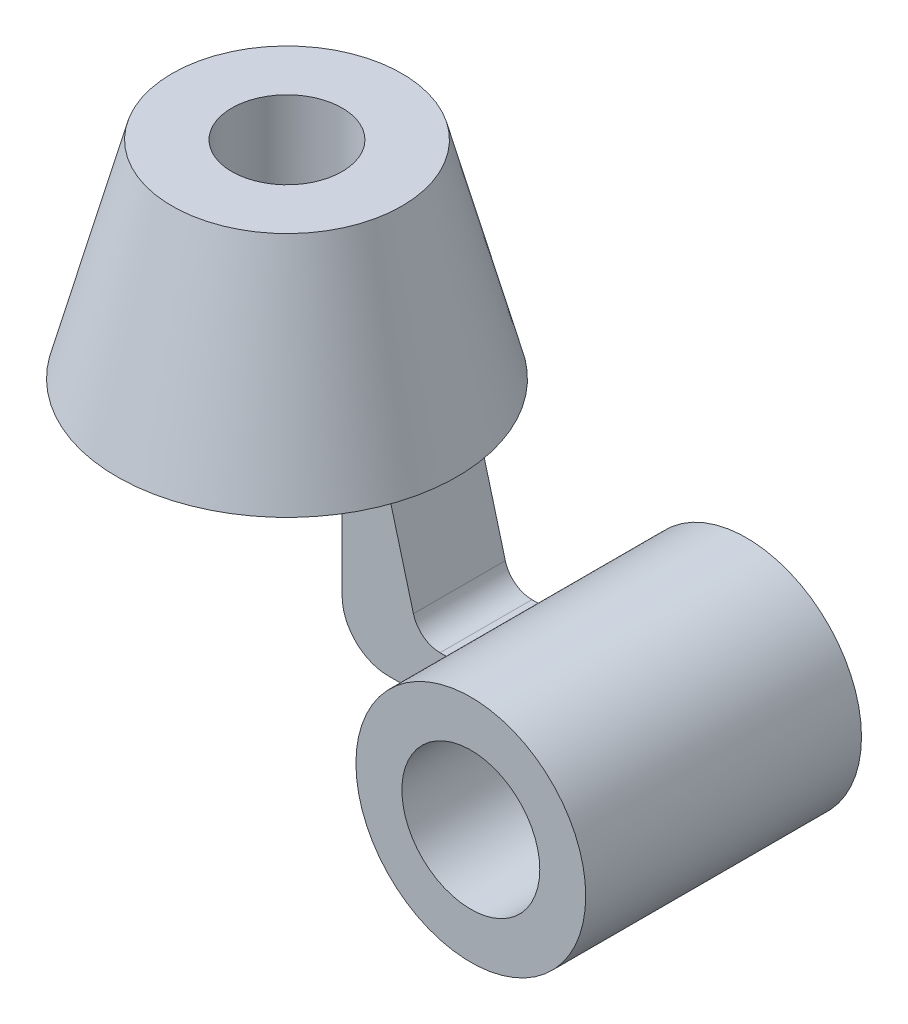
ISO-10303-21;
HEADER;
FILE_DESCRIPTION(('STEP AP214'),'2;1');
FILE_NAME('part.step','',(''),(''),'','','');
FILE_SCHEMA(('AUTOMOTIVE_DESIGN { 1 0 10303 214 1 1 1 1 }'));
ENDSEC;
DATA;
#1=APPLICATION_CONTEXT('core data for automotive mechanical design processes');
#2=APPLICATION_PROTOCOL_DEFINITION('international standard','automotive_design',2000,#1);
#3=PRODUCT_CONTEXT('',#1,'mechanical');
#4=PRODUCT('Part','Part','',(#3));
#5=PRODUCT_RELATED_PRODUCT_CATEGORY('part','',(#4));
#6=PRODUCT_DEFINITION_FORMATION('','',#4);
#7=PRODUCT_DEFINITION_CONTEXT('part definition',#1,'design');
#8=PRODUCT_DEFINITION('design','',#6,#7);
#9=PRODUCT_DEFINITION_SHAPE('','',#8);
#10=(LENGTH_UNIT() NAMED_UNIT(*) SI_UNIT(.MILLI.,.METRE.));
#11=(NAMED_UNIT(*) PLANE_ANGLE_UNIT() SI_UNIT($,.RADIAN.));
#12=(NAMED_UNIT(*) SI_UNIT($,.STERADIAN.) SOLID_ANGLE_UNIT());
#13=UNCERTAINTY_MEASURE_WITH_UNIT(LENGTH_MEASURE(1.E-05),#10,'distance_accuracy_value','');
#14=(GEOMETRIC_REPRESENTATION_CONTEXT(3) GLOBAL_UNCERTAINTY_ASSIGNED_CONTEXT((#13)) GLOBAL_UNIT_ASSIGNED_CONTEXT((#10,
#11,#12)) REPRESENTATION_CONTEXT('',''));
#15=CARTESIAN_POINT('',(0.,0.,0.));
#16=DIRECTION('',(0.,0.,1.));
#17=DIRECTION('',(1.,0.,0.));
#18=AXIS2_PLACEMENT_3D('',#15,#16,#17);
#19=CARTESIAN_POINT('',(0.,0.,0.));
#20=DIRECTION('',(0.,1.,0.));
#21=DIRECTION('',(-1.,0.,0.));
#22=AXIS2_PLACEMENT_3D('',#19,#20,#21);
#23=PLANE('',#22);
#24=CARTESIAN_POINT('',(0.,0.,0.));
#25=DIRECTION('',(0.,1.,0.));
#26=DIRECTION('',(-1.,0.,0.));
#27=AXIS2_PLACEMENT_3D('',#24,#25,#26);
#28=CIRCLE('',#27,12.);
#29=CARTESIAN_POINT('',(-12.,0.,0.));
#30=VERTEX_POINT('',#29);
#31=EDGE_CURVE('E228',#30,#30,#28,.T.);
#32=ORIENTED_EDGE('',*,*,#31,.T.);
#33=EDGE_LOOP('',(#32));
#34=FACE_BOUND('',#33,.T.);
#35=DIRECTION('',(-1.,0.,0.));
#36=VECTOR('',#35,1.);
#37=CARTESIAN_POINT('',(32.,0.,-10.));
#38=LINE('',#37,#36);
#39=CARTESIAN_POINT('',(32.,0.,-10.));
#40=VERTEX_POINT('',#39);
#41=CARTESIAN_POINT('',(22.,0.,-10.));
#42=VERTEX_POINT('',#41);
#43=EDGE_CURVE('E152',#40,#42,#38,.T.);
#44=ORIENTED_EDGE('',*,*,#43,.T.);
#45=DIRECTION('',(0.,0.,1.));
#46=VECTOR('',#45,1.);
#47=CARTESIAN_POINT('',(22.,0.,-10.));
#48=LINE('',#47,#46);
#49=CARTESIAN_POINT('',(22.,0.,10.));
#50=VERTEX_POINT('',#49);
#51=EDGE_CURVE('E170',#42,#50,#48,.T.);
#52=ORIENTED_EDGE('',*,*,#51,.T.);
#53=DIRECTION('',(-1.,0.,0.));
#54=VECTOR('',#53,1.);
#55=CARTESIAN_POINT('',(32.,0.,10.));
#56=LINE('',#55,#54);
#57=CARTESIAN_POINT('',(32.,0.,10.));
#58=VERTEX_POINT('',#57);
#59=EDGE_CURVE('E217',#58,#50,#56,.T.);
#60=ORIENTED_EDGE('',*,*,#59,.F.);
#61=DIRECTION('',(0.,0.,1.));
#62=VECTOR('',#61,1.);
#63=CARTESIAN_POINT('',(32.,0.,-10.));
#64=LINE('',#63,#62);
#65=EDGE_CURVE('E169',#40,#58,#64,.T.);
#66=ORIENTED_EDGE('',*,*,#65,.F.);
#67=EDGE_LOOP('',(#44,#52,#60,#66));
#68=FACE_BOUND('',#67,.T.);
#69=CARTESIAN_POINT('',(0.,0.,0.));
#70=DIRECTION('',(0.,1.,0.));
#71=DIRECTION('',(-1.,0.,0.));
#72=AXIS2_PLACEMENT_3D('',#69,#70,#71);
#73=CIRCLE('',#72,37.);
#74=CARTESIAN_POINT('',(-37.,0.,0.));
#75=VERTEX_POINT('',#74);
#76=EDGE_CURVE('E130',#75,#75,#73,.T.);
#77=ORIENTED_EDGE('',*,*,#76,.F.);
#78=EDGE_LOOP('',(#77));
#79=FACE_BOUND('',#78,.T.);
#80=ADVANCED_FACE('F39',(#34,#68,#79),#23,.F.);
#81=CARTESIAN_POINT('',(0.,0.,0.));
#82=DIRECTION('',(0.,-1.,0.));
#83=DIRECTION('',(1.,0.,0.));
#84=AXIS2_PLACEMENT_3D('',#81,#82,#83);
#85=CONICAL_SURFACE('',#84,37.,0.260602391747341);
#86=CARTESIAN_POINT('',(0.,45.,0.));
#87=DIRECTION('',(0.,1.,0.));
#88=DIRECTION('',(-1.,0.,0.));
#89=AXIS2_PLACEMENT_3D('',#86,#87,#88);
#90=CIRCLE('',#89,25.);
#91=CARTESIAN_POINT('',(-25.,45.,0.));
#92=VERTEX_POINT('',#91);
#93=EDGE_CURVE('E135',#92,#92,#90,.T.);
#94=ORIENTED_EDGE('',*,*,#93,.F.);
#95=EDGE_LOOP('',(#94));
#96=FACE_BOUND('',#95,.T.);
#97=ORIENTED_EDGE('',*,*,#76,.T.);
#98=EDGE_LOOP('',(#97));
#99=FACE_BOUND('',#98,.T.);
#100=ADVANCED_FACE('F180',(#96,#99),#85,.T.);
#101=CARTESIAN_POINT('',(25.,45.,0.));
#102=DIRECTION('',(0.,-1.,0.));
#103=DIRECTION('',(1.,0.,0.));
#104=AXIS2_PLACEMENT_3D('',#101,#102,#103);
#105=PLANE('',#104);
#106=CARTESIAN_POINT('',(0.,45.,0.));
#107=DIRECTION('',(0.,1.,0.));
#108=DIRECTION('',(0.,0.,1.));
#109=AXIS2_PLACEMENT_3D('',#106,#107,#108);
#110=CIRCLE('',#109,12.);
#111=CARTESIAN_POINT('',(0.,45.,12.));
#112=VERTEX_POINT('',#111);
#113=EDGE_CURVE('E231',#112,#112,#110,.T.);
#114=ORIENTED_EDGE('',*,*,#113,.F.);
#115=EDGE_LOOP('',(#114));
#116=FACE_BOUND('',#115,.T.);
#117=ORIENTED_EDGE('',*,*,#93,.T.);
#118=EDGE_LOOP('',(#117));
#119=FACE_BOUND('',#118,.T.);
#120=ADVANCED_FACE('F174',(#116,#119),#105,.F.);
#121=CARTESIAN_POINT('',(38.6987298107779,-25.,-10.));
#122=DIRECTION('',(0.96592582628907,0.258819045102515,0.));
#123=DIRECTION('',(-0.258819045102515,0.96592582628907,0.));
#124=AXIS2_PLACEMENT_3D('',#121,#122,#123);
#125=PLANE('',#124);
#126=DIRECTION('',(-0.258819045102515,0.96592582628907,0.));
#127=VECTOR('',#126,1.);
#128=CARTESIAN_POINT('',(38.6987298107779,-25.,10.));
#129=LINE('',#128,#127);
#130=CARTESIAN_POINT('',(37.5071367809173,-20.5529142706151,10.));
#131=VERTEX_POINT('',#130);
#132=EDGE_CURVE('E155',#131,#58,#129,.T.);
#133=ORIENTED_EDGE('',*,*,#132,.F.);
#134=DIRECTION('',(0.,0.,1.));
#135=VECTOR('',#134,1.);
#136=CARTESIAN_POINT('',(37.5071367809173,-20.5529142706151,-10.));
#137=LINE('',#136,#135);
#138=CARTESIAN_POINT('',(37.5071367809173,-20.5529142706151,-10.));
#139=VERTEX_POINT('',#138);
#140=EDGE_CURVE('E53',#131,#139,#137,.F.);
#141=ORIENTED_EDGE('',*,*,#140,.T.);
#142=DIRECTION('',(-0.258819045102515,0.96592582628907,0.));
#143=VECTOR('',#142,1.);
#144=CARTESIAN_POINT('',(38.6987298107779,-25.,-10.));
#145=LINE('',#144,#143);
#146=EDGE_CURVE('E164',#139,#40,#145,.T.);
#147=ORIENTED_EDGE('',*,*,#146,.T.);
#148=ORIENTED_EDGE('',*,*,#65,.T.);
#149=EDGE_LOOP('',(#133,#141,#147,#148));
#150=FACE_BOUND('',#149,.T.);
#151=ADVANCED_FACE('F220',(#150),#125,.T.);
#152=CARTESIAN_POINT('',(55.5785022667471,-25.,-10.));
#153=DIRECTION('',(0.,1.,0.));
#154=DIRECTION('',(-1.,0.,0.));
#155=AXIS2_PLACEMENT_3D('',#152,#153,#154);
#156=PLANE('',#155);
#157=DIRECTION('',(-1.,0.,0.));
#158=VECTOR('',#157,1.);
#159=CARTESIAN_POINT('',(55.5785022667471,-25.,-10.));
#160=LINE('',#159,#158);
#161=CARTESIAN_POINT('',(47.0871215252208,-25.,-10.));
#162=VERTEX_POINT('',#161);
#163=CARTESIAN_POINT('',(43.3026917386517,-25.,-10.));
#164=VERTEX_POINT('',#163);
#165=EDGE_CURVE('E149',#162,#164,#160,.T.);
#166=ORIENTED_EDGE('',*,*,#165,.T.);
#167=DIRECTION('',(0.,0.,1.));
#168=VECTOR('',#167,1.);
#169=CARTESIAN_POINT('',(43.3026917386517,-25.,10.));
#170=LINE('',#169,#168);
#171=CARTESIAN_POINT('',(43.3026917386517,-25.,10.));
#172=VERTEX_POINT('',#171);
#173=EDGE_CURVE('E143',#164,#172,#170,.T.);
#174=ORIENTED_EDGE('',*,*,#173,.T.);
#175=DIRECTION('',(-1.,0.,0.));
#176=VECTOR('',#175,1.);
#177=CARTESIAN_POINT('',(55.5785022667471,-25.,10.));
#178=LINE('',#177,#176);
#179=CARTESIAN_POINT('',(47.0871215252208,-25.,10.));
#180=VERTEX_POINT('',#179);
#181=EDGE_CURVE('E109',#180,#172,#178,.T.);
#182=ORIENTED_EDGE('',*,*,#181,.F.);
#183=DIRECTION('',(0.,0.,1.));
#184=VECTOR('',#183,1.);
#185=CARTESIAN_POINT('',(47.0871215252208,-25.,-30.));
#186=LINE('',#185,#184);
#187=EDGE_CURVE('E121',#162,#180,#186,.T.);
#188=ORIENTED_EDGE('',*,*,#187,.F.);
#189=EDGE_LOOP('',(#166,#174,#182,#188));
#190=FACE_BOUND('',#189,.T.);
#191=ADVANCED_FACE('F150',(#190),#156,.T.);
#192=CARTESIAN_POINT('',(22.,-35.,-10.));
#193=DIRECTION('',(0.,-1.,0.));
#194=DIRECTION('',(0.,0.,-1.));
#195=AXIS2_PLACEMENT_3D('',#192,#193,#194);
#196=PLANE('',#195);
#197=DIRECTION('',(1.,0.,0.));
#198=VECTOR('',#197,1.);
#199=CARTESIAN_POINT('',(22.,-35.,10.));
#200=LINE('',#199,#198);
#201=CARTESIAN_POINT('',(32.,-35.,10.));
#202=VERTEX_POINT('',#201);
#203=CARTESIAN_POINT('',(45.,-35.,10.));
#204=VERTEX_POINT('',#203);
#205=EDGE_CURVE('E99',#202,#204,#200,.T.);
#206=ORIENTED_EDGE('',*,*,#205,.F.);
#207=DIRECTION('',(0.,0.,1.));
#208=VECTOR('',#207,1.);
#209=CARTESIAN_POINT('',(32.,-35.,-10.));
#210=LINE('',#209,#208);
#211=CARTESIAN_POINT('',(32.,-35.,-10.));
#212=VERTEX_POINT('',#211);
#213=EDGE_CURVE('E140',#202,#212,#210,.F.);
#214=ORIENTED_EDGE('',*,*,#213,.T.);
#215=DIRECTION('',(1.,0.,0.));
#216=VECTOR('',#215,1.);
#217=CARTESIAN_POINT('',(22.,-35.,-10.));
#218=LINE('',#217,#216);
#219=CARTESIAN_POINT('',(45.,-35.,-10.));
#220=VERTEX_POINT('',#219);
#221=EDGE_CURVE('E120',#212,#220,#218,.T.);
#222=ORIENTED_EDGE('',*,*,#221,.T.);
#223=DIRECTION('',(0.,0.,1.));
#224=VECTOR('',#223,1.);
#225=CARTESIAN_POINT('',(45.,-35.,-30.));
#226=LINE('',#225,#224);
#227=EDGE_CURVE('E111',#204,#220,#226,.F.);
#228=ORIENTED_EDGE('',*,*,#227,.F.);
#229=EDGE_LOOP('',(#206,#214,#222,#228));
#230=FACE_BOUND('',#229,.T.);
#231=ADVANCED_FACE('F113',(#230),#196,.T.);
#232=CARTESIAN_POINT('',(22.,0.,-10.));
#233=DIRECTION('',(-1.,0.,0.));
#234=DIRECTION('',(0.,-1.,0.));
#235=AXIS2_PLACEMENT_3D('',#232,#233,#234);
#236=PLANE('',#235);
#237=DIRECTION('',(0.,-1.,0.));
#238=VECTOR('',#237,1.);
#239=CARTESIAN_POINT('',(22.,0.,-10.));
#240=LINE('',#239,#238);
#241=CARTESIAN_POINT('',(22.,-25.,-10.));
#242=VERTEX_POINT('',#241);
#243=EDGE_CURVE('E159',#42,#242,#240,.T.);
#244=ORIENTED_EDGE('',*,*,#243,.T.);
#245=DIRECTION('',(0.,0.,1.));
#246=VECTOR('',#245,1.);
#247=CARTESIAN_POINT('',(22.,-25.,-10.));
#248=LINE('',#247,#246);
#249=CARTESIAN_POINT('',(22.,-25.,10.));
#250=VERTEX_POINT('',#249);
#251=EDGE_CURVE('E127',#242,#250,#248,.T.);
#252=ORIENTED_EDGE('',*,*,#251,.T.);
#253=DIRECTION('',(0.,-1.,0.));
#254=VECTOR('',#253,1.);
#255=CARTESIAN_POINT('',(22.,0.,10.));
#256=LINE('',#255,#254);
#257=EDGE_CURVE('E112',#50,#250,#256,.T.);
#258=ORIENTED_EDGE('',*,*,#257,.F.);
#259=ORIENTED_EDGE('',*,*,#51,.F.);
#260=EDGE_LOOP('',(#244,#252,#258,#259));
#261=FACE_BOUND('',#260,.T.);
#262=ADVANCED_FACE('F213',(#261),#236,.T.);
#263=CARTESIAN_POINT('',(0.,0.,-10.));
#264=DIRECTION('',(0.,0.,1.));
#265=DIRECTION('',(1.,0.,0.));
#266=AXIS2_PLACEMENT_3D('',#263,#264,#265);
#267=PLANE('',#266);
#268=ORIENTED_EDGE('',*,*,#221,.F.);
#269=CARTESIAN_POINT('',(32.,-25.,-10.));
#270=DIRECTION('',(0.,0.,1.));
#271=DIRECTION('',(1.,0.,0.));
#272=AXIS2_PLACEMENT_3D('',#269,#270,#271);
#273=CIRCLE('',#272,10.);
#274=EDGE_CURVE('E137',#212,#242,#273,.F.);
#275=ORIENTED_EDGE('',*,*,#274,.T.);
#276=ORIENTED_EDGE('',*,*,#243,.F.);
#277=ORIENTED_EDGE('',*,*,#43,.F.);
#278=ORIENTED_EDGE('',*,*,#146,.F.);
#279=CARTESIAN_POINT('',(43.3026917386517,-19.,-10.));
#280=DIRECTION('',(0.,0.,1.));
#281=DIRECTION('',(1.,0.,0.));
#282=AXIS2_PLACEMENT_3D('',#279,#280,#281);
#283=CIRCLE('',#282,6.);
#284=EDGE_CURVE('E11',#139,#164,#283,.T.);
#285=ORIENTED_EDGE('',*,*,#284,.T.);
#286=ORIENTED_EDGE('',*,*,#165,.F.);
#287=CARTESIAN_POINT('',(70.,-35.,-10.));
#288=DIRECTION('',(0.,0.,1.));
#289=DIRECTION('',(1.,0.,0.));
#290=AXIS2_PLACEMENT_3D('',#287,#288,#289);
#291=CIRCLE('',#290,25.);
#292=EDGE_CURVE('E218',#162,#220,#291,.T.);
#293=ORIENTED_EDGE('',*,*,#292,.T.);
#294=EDGE_LOOP('',(#268,#275,#276,#277,#278,#285,#286,#293));
#295=FACE_BOUND('',#294,.T.);
#296=ADVANCED_FACE('F207',(#295),#267,.F.);
#297=CARTESIAN_POINT('',(0.,0.,10.));
#298=DIRECTION('',(0.,0.,1.));
#299=DIRECTION('',(1.,0.,0.));
#300=AXIS2_PLACEMENT_3D('',#297,#298,#299);
#301=PLANE('',#300);
#302=ORIENTED_EDGE('',*,*,#257,.T.);
#303=CARTESIAN_POINT('',(32.,-25.,10.));
#304=DIRECTION('',(0.,0.,1.));
#305=DIRECTION('',(1.,0.,0.));
#306=AXIS2_PLACEMENT_3D('',#303,#304,#305);
#307=CIRCLE('',#306,10.);
#308=EDGE_CURVE('E110',#250,#202,#307,.T.);
#309=ORIENTED_EDGE('',*,*,#308,.T.);
#310=ORIENTED_EDGE('',*,*,#205,.T.);
#311=CARTESIAN_POINT('',(70.,-35.,10.));
#312=DIRECTION('',(0.,0.,1.));
#313=DIRECTION('',(1.,0.,0.));
#314=AXIS2_PLACEMENT_3D('',#311,#312,#313);
#315=CIRCLE('',#314,25.);
#316=EDGE_CURVE('E104',#180,#204,#315,.T.);
#317=ORIENTED_EDGE('',*,*,#316,.F.);
#318=ORIENTED_EDGE('',*,*,#181,.T.);
#319=CARTESIAN_POINT('',(43.3026917386517,-19.,10.));
#320=DIRECTION('',(0.,0.,1.));
#321=DIRECTION('',(1.,0.,0.));
#322=AXIS2_PLACEMENT_3D('',#319,#320,#321);
#323=CIRCLE('',#322,6.);
#324=EDGE_CURVE('E50',#172,#131,#323,.F.);
#325=ORIENTED_EDGE('',*,*,#324,.T.);
#326=ORIENTED_EDGE('',*,*,#132,.T.);
#327=ORIENTED_EDGE('',*,*,#59,.T.);
#328=EDGE_LOOP('',(#302,#309,#310,#317,#318,#325,#326,#327));
#329=FACE_BOUND('',#328,.T.);
#330=ADVANCED_FACE('F103',(#329),#301,.T.);
#331=CARTESIAN_POINT('',(70.,-35.,-30.));
#332=DIRECTION('',(0.,0.,1.));
#333=DIRECTION('',(1.,0.,0.));
#334=AXIS2_PLACEMENT_3D('',#331,#332,#333);
#335=CYLINDRICAL_SURFACE('',#334,25.);
#336=CARTESIAN_POINT('',(70.,-35.,30.));
#337=DIRECTION('',(0.,0.,1.));
#338=DIRECTION('',(1.,0.,0.));
#339=AXIS2_PLACEMENT_3D('',#336,#337,#338);
#340=CIRCLE('',#339,25.);
#341=CARTESIAN_POINT('',(95.,-35.,30.));
#342=VERTEX_POINT('',#341);
#343=EDGE_CURVE('E226',#342,#342,#340,.T.);
#344=ORIENTED_EDGE('',*,*,#343,.F.);
#345=EDGE_LOOP('',(#344));
#346=FACE_BOUND('',#345,.T.);
#347=CARTESIAN_POINT('',(70.,-35.,-30.));
#348=DIRECTION('',(0.,0.,1.));
#349=DIRECTION('',(1.,0.,0.));
#350=AXIS2_PLACEMENT_3D('',#347,#348,#349);
#351=CIRCLE('',#350,25.);
#352=CARTESIAN_POINT('',(95.,-35.,-30.));
#353=VERTEX_POINT('',#352);
#354=EDGE_CURVE('E125',#353,#353,#351,.T.);
#355=ORIENTED_EDGE('',*,*,#354,.T.);
#356=EDGE_LOOP('',(#355));
#357=FACE_BOUND('',#356,.T.);
#358=ORIENTED_EDGE('',*,*,#292,.F.);
#359=ORIENTED_EDGE('',*,*,#187,.T.);
#360=ORIENTED_EDGE('',*,*,#316,.T.);
#361=ORIENTED_EDGE('',*,*,#227,.T.);
#362=EDGE_LOOP('',(#358,#359,#360,#361));
#363=FACE_BOUND('',#362,.T.);
#364=ADVANCED_FACE('F124',(#346,#357,#363),#335,.T.);
#365=CARTESIAN_POINT('',(70.,-35.,-30.));
#366=DIRECTION('',(0.,0.,1.));
#367=DIRECTION('',(1.,0.,0.));
#368=AXIS2_PLACEMENT_3D('',#365,#366,#367);
#369=PLANE('',#368);
#370=CARTESIAN_POINT('',(70.,-35.,-30.));
#371=DIRECTION('',(0.,0.,1.));
#372=DIRECTION('',(1.,0.,0.));
#373=AXIS2_PLACEMENT_3D('',#370,#371,#372);
#374=CIRCLE('',#373,15.);
#375=CARTESIAN_POINT('',(85.,-35.,-30.));
#376=VERTEX_POINT('',#375);
#377=EDGE_CURVE('E232',#376,#376,#374,.T.);
#378=ORIENTED_EDGE('',*,*,#377,.T.);
#379=EDGE_LOOP('',(#378));
#380=FACE_BOUND('',#379,.T.);
#381=ORIENTED_EDGE('',*,*,#354,.F.);
#382=EDGE_LOOP('',(#381));
#383=FACE_BOUND('',#382,.T.);
#384=ADVANCED_FACE('F201',(#380,#383),#369,.F.);
#385=CARTESIAN_POINT('',(70.,-35.,30.));
#386=DIRECTION('',(0.,0.,1.));
#387=DIRECTION('',(1.,0.,0.));
#388=AXIS2_PLACEMENT_3D('',#385,#386,#387);
#389=PLANE('',#388);
#390=CARTESIAN_POINT('',(70.,-35.,30.));
#391=DIRECTION('',(0.,0.,1.));
#392=DIRECTION('',(1.,0.,0.));
#393=AXIS2_PLACEMENT_3D('',#390,#391,#392);
#394=CIRCLE('',#393,15.);
#395=CARTESIAN_POINT('',(85.,-35.,30.));
#396=VERTEX_POINT('',#395);
#397=EDGE_CURVE('E240',#396,#396,#394,.T.);
#398=ORIENTED_EDGE('',*,*,#397,.F.);
#399=EDGE_LOOP('',(#398));
#400=FACE_BOUND('',#399,.T.);
#401=ORIENTED_EDGE('',*,*,#343,.T.);
#402=EDGE_LOOP('',(#401));
#403=FACE_BOUND('',#402,.T.);
#404=ADVANCED_FACE('F194',(#400,#403),#389,.T.);
#405=CARTESIAN_POINT('',(32.,-25.,-10.));
#406=DIRECTION('',(0.,0.,1.));
#407=DIRECTION('',(1.,0.,0.));
#408=AXIS2_PLACEMENT_3D('',#405,#406,#407);
#409=CYLINDRICAL_SURFACE('',#408,10.);
#410=ORIENTED_EDGE('',*,*,#274,.F.);
#411=ORIENTED_EDGE('',*,*,#213,.F.);
#412=ORIENTED_EDGE('',*,*,#308,.F.);
#413=ORIENTED_EDGE('',*,*,#251,.F.);
#414=EDGE_LOOP('',(#410,#411,#412,#413));
#415=FACE_BOUND('',#414,.T.);
#416=ADVANCED_FACE('F193',(#415),#409,.T.);
#417=CARTESIAN_POINT('',(43.3026917386517,-19.,-10.));
#418=DIRECTION('',(0.,0.,-1.));
#419=DIRECTION('',(-1.,0.,0.));
#420=AXIS2_PLACEMENT_3D('',#417,#418,#419);
#421=CYLINDRICAL_SURFACE('',#420,6.);
#422=ORIENTED_EDGE('',*,*,#284,.F.);
#423=ORIENTED_EDGE('',*,*,#140,.F.);
#424=ORIENTED_EDGE('',*,*,#324,.F.);
#425=ORIENTED_EDGE('',*,*,#173,.F.);
#426=EDGE_LOOP('',(#422,#423,#424,#425));
#427=FACE_BOUND('',#426,.T.);
#428=ADVANCED_FACE('F41',(#427),#421,.F.);
#429=CARTESIAN_POINT('',(0.,45.,0.));
#430=DIRECTION('',(0.,1.,0.));
#431=DIRECTION('',(0.,0.,1.));
#432=AXIS2_PLACEMENT_3D('',#429,#430,#431);
#433=CYLINDRICAL_SURFACE('',#432,12.);
#434=ORIENTED_EDGE('',*,*,#113,.T.);
#435=EDGE_LOOP('',(#434));
#436=FACE_BOUND('',#435,.T.);
#437=ORIENTED_EDGE('',*,*,#31,.F.);
#438=EDGE_LOOP('',(#437));
#439=FACE_BOUND('',#438,.T.);
#440=ADVANCED_FACE('F203',(#436,#439),#433,.F.);
#441=CARTESIAN_POINT('',(70.,-35.,30.));
#442=DIRECTION('',(0.,0.,1.));
#443=DIRECTION('',(1.,0.,0.));
#444=AXIS2_PLACEMENT_3D('',#441,#442,#443);
#445=CYLINDRICAL_SURFACE('',#444,15.);
#446=ORIENTED_EDGE('',*,*,#397,.T.);
#447=EDGE_LOOP('',(#446));
#448=FACE_BOUND('',#447,.T.);
#449=ORIENTED_EDGE('',*,*,#377,.F.);
#450=EDGE_LOOP('',(#449));
#451=FACE_BOUND('',#450,.T.);
#452=ADVANCED_FACE('F241',(#448,#451),#445,.F.);
#453=CLOSED_SHELL('',(#80,#100,#120,#151,#191,#231,#262,#296,#330,#364,#384,#404,#416,#428,#440,#452));
#454=MANIFOLD_SOLID_BREP('B2',#453);
#455=ADVANCED_BREP_SHAPE_REPRESENTATION('',(#18,#454),#14);
#456=SHAPE_DEFINITION_REPRESENTATION(#9,#455);
ENDSEC;
END-ISO-10303-21;
